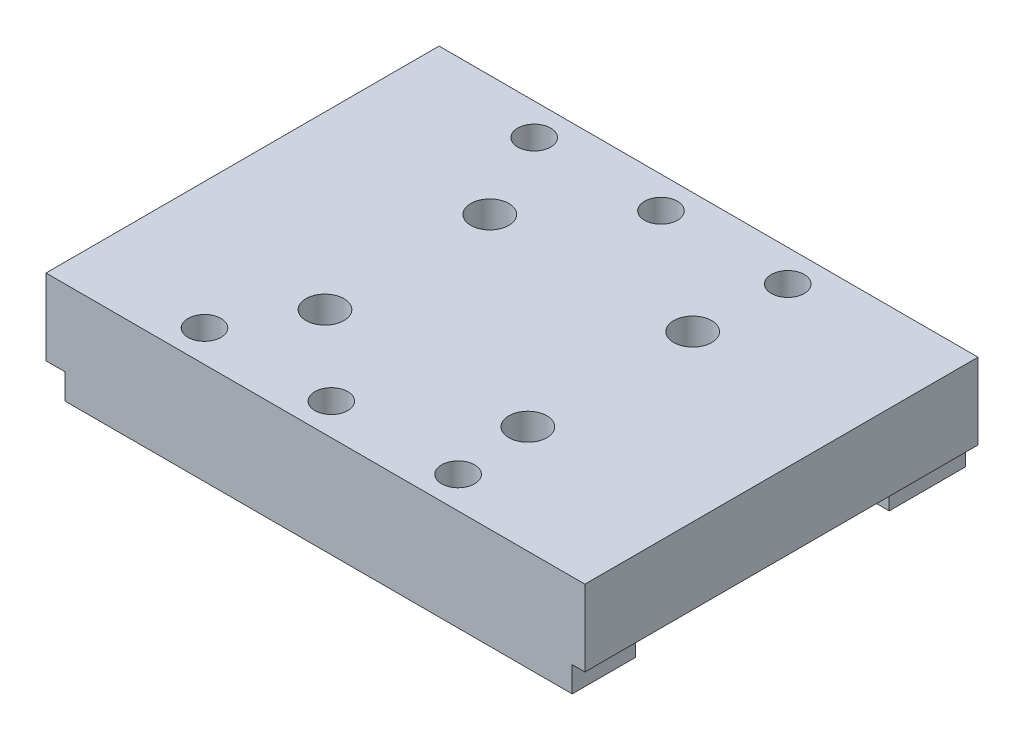
ISO-10303-21;
HEADER;
FILE_DESCRIPTION(('STEP AP214'),'2;1');
FILE_NAME('part.step','',(''),(''),'','','');
FILE_SCHEMA(('AUTOMOTIVE_DESIGN { 1 0 10303 214 1 1 1 1 }'));
ENDSEC;
DATA;
#1=APPLICATION_CONTEXT('core data for automotive mechanical design processes');
#2=APPLICATION_PROTOCOL_DEFINITION('international standard','automotive_design',2000,#1);
#3=PRODUCT_CONTEXT('',#1,'mechanical');
#4=PRODUCT('Part','Part','',(#3));
#5=PRODUCT_RELATED_PRODUCT_CATEGORY('part','',(#4));
#6=PRODUCT_DEFINITION_FORMATION('','',#4);
#7=PRODUCT_DEFINITION_CONTEXT('part definition',#1,'design');
#8=PRODUCT_DEFINITION('design','',#6,#7);
#9=PRODUCT_DEFINITION_SHAPE('','',#8);
#10=(LENGTH_UNIT() NAMED_UNIT(*) SI_UNIT(.MILLI.,.METRE.));
#11=(NAMED_UNIT(*) PLANE_ANGLE_UNIT() SI_UNIT($,.RADIAN.));
#12=(NAMED_UNIT(*) SI_UNIT($,.STERADIAN.) SOLID_ANGLE_UNIT());
#13=UNCERTAINTY_MEASURE_WITH_UNIT(LENGTH_MEASURE(1.E-05),#10,'distance_accuracy_value','');
#14=(GEOMETRIC_REPRESENTATION_CONTEXT(3) GLOBAL_UNCERTAINTY_ASSIGNED_CONTEXT((#13)) GLOBAL_UNIT_ASSIGNED_CONTEXT((#10,
#11,#12)) REPRESENTATION_CONTEXT('',''));
#15=CARTESIAN_POINT('',(0.,0.,0.));
#16=DIRECTION('',(0.,0.,1.));
#17=DIRECTION('',(1.,0.,0.));
#18=AXIS2_PLACEMENT_3D('',#15,#16,#17);
#19=CARTESIAN_POINT('',(40.,3.,0.));
#20=DIRECTION('',(-1.,0.,0.));
#21=DIRECTION('',(0.,0.,1.));
#22=AXIS2_PLACEMENT_3D('',#19,#20,#21);
#23=PLANE('',#22);
#24=DIRECTION('',(0.,0.,-1.));
#25=VECTOR('',#24,1.);
#26=CARTESIAN_POINT('',(40.,-3.,5.));
#27=LINE('',#26,#25);
#28=CARTESIAN_POINT('',(40.,-3.,5.));
#29=VERTEX_POINT('',#28);
#30=CARTESIAN_POINT('',(40.,-3.,0.));
#31=VERTEX_POINT('',#30);
#32=EDGE_CURVE('E43',#29,#31,#27,.T.);
#33=ORIENTED_EDGE('',*,*,#32,.F.);
#34=DIRECTION('',(0.,1.,0.));
#35=VECTOR('',#34,1.);
#36=CARTESIAN_POINT('',(40.,3.,5.));
#37=LINE('',#36,#35);
#38=CARTESIAN_POINT('',(40.,-5.,5.));
#39=VERTEX_POINT('',#38);
#40=EDGE_CURVE('E160',#39,#29,#37,.T.);
#41=ORIENTED_EDGE('',*,*,#40,.F.);
#42=DIRECTION('',(0.,0.,-1.));
#43=VECTOR('',#42,1.);
#44=CARTESIAN_POINT('',(40.,-5.,5.));
#45=LINE('',#44,#43);
#46=CARTESIAN_POINT('',(40.,-5.,0.));
#47=VERTEX_POINT('',#46);
#48=EDGE_CURVE('E255',#39,#47,#45,.T.);
#49=ORIENTED_EDGE('',*,*,#48,.T.);
#50=DIRECTION('',(0.,1.,0.));
#51=VECTOR('',#50,1.);
#52=CARTESIAN_POINT('',(40.,3.,0.));
#53=LINE('',#52,#51);
#54=EDGE_CURVE('E250',#47,#31,#53,.T.);
#55=ORIENTED_EDGE('',*,*,#54,.T.);
#56=EDGE_LOOP('',(#33,#41,#49,#55));
#57=FACE_BOUND('',#56,.T.);
#58=ADVANCED_FACE('F32',(#57),#23,.F.);
#59=CARTESIAN_POINT('',(40.,-3.,-20.));
#60=VERTEX_POINT('',#59);
#61=CARTESIAN_POINT('',(40.,-3.,-26.));
#62=VERTEX_POINT('',#61);
#63=EDGE_CURVE('E11',#60,#62,#27,.T.);
#64=ORIENTED_EDGE('',*,*,#63,.F.);
#65=DIRECTION('',(0.,-1.,0.));
#66=VECTOR('',#65,1.);
#67=CARTESIAN_POINT('',(40.,3.,-20.));
#68=LINE('',#67,#66);
#69=CARTESIAN_POINT('',(40.,-5.,-20.));
#70=VERTEX_POINT('',#69);
#71=EDGE_CURVE('E219',#60,#70,#68,.T.);
#72=ORIENTED_EDGE('',*,*,#71,.T.);
#73=DIRECTION('',(0.,0.,1.));
#74=VECTOR('',#73,1.);
#75=CARTESIAN_POINT('',(40.,-5.,-26.));
#76=LINE('',#75,#74);
#77=CARTESIAN_POINT('',(40.,-5.,-26.));
#78=VERTEX_POINT('',#77);
#79=EDGE_CURVE('E243',#78,#70,#76,.T.);
#80=ORIENTED_EDGE('',*,*,#79,.F.);
#81=DIRECTION('',(0.,-1.,0.));
#82=VECTOR('',#81,1.);
#83=CARTESIAN_POINT('',(40.,3.,-26.));
#84=LINE('',#83,#82);
#85=EDGE_CURVE('E222',#62,#78,#84,.T.);
#86=ORIENTED_EDGE('',*,*,#85,.F.);
#87=EDGE_LOOP('',(#64,#72,#80,#86));
#88=FACE_BOUND('',#87,.T.);
#89=ADVANCED_FACE('F322',(#88),#23,.F.);
#90=CARTESIAN_POINT('',(0.,3.,0.));
#91=DIRECTION('',(1.,0.,0.));
#92=DIRECTION('',(0.,0.,-1.));
#93=AXIS2_PLACEMENT_3D('',#90,#91,#92);
#94=PLANE('',#93);
#95=DIRECTION('',(0.,0.,1.));
#96=VECTOR('',#95,1.);
#97=CARTESIAN_POINT('',(0.,-3.,-26.));
#98=LINE('',#97,#96);
#99=CARTESIAN_POINT('',(0.,-3.,-26.));
#100=VERTEX_POINT('',#99);
#101=CARTESIAN_POINT('',(0.,-3.,-20.));
#102=VERTEX_POINT('',#101);
#103=EDGE_CURVE('E177',#100,#102,#98,.T.);
#104=ORIENTED_EDGE('',*,*,#103,.F.);
#105=DIRECTION('',(0.,1.,0.));
#106=VECTOR('',#105,1.);
#107=CARTESIAN_POINT('',(0.,3.,-26.));
#108=LINE('',#107,#106);
#109=CARTESIAN_POINT('',(0.,-5.,-26.));
#110=VERTEX_POINT('',#109);
#111=EDGE_CURVE('E227',#110,#100,#108,.T.);
#112=ORIENTED_EDGE('',*,*,#111,.F.);
#113=DIRECTION('',(0.,0.,1.));
#114=VECTOR('',#113,1.);
#115=CARTESIAN_POINT('',(0.,-5.,-26.));
#116=LINE('',#115,#114);
#117=CARTESIAN_POINT('',(0.,-5.,-20.));
#118=VERTEX_POINT('',#117);
#119=EDGE_CURVE('E232',#110,#118,#116,.T.);
#120=ORIENTED_EDGE('',*,*,#119,.T.);
#121=DIRECTION('',(0.,1.,0.));
#122=VECTOR('',#121,1.);
#123=CARTESIAN_POINT('',(0.,3.,-20.));
#124=LINE('',#123,#122);
#125=EDGE_CURVE('E225',#118,#102,#124,.T.);
#126=ORIENTED_EDGE('',*,*,#125,.T.);
#127=EDGE_LOOP('',(#104,#112,#120,#126));
#128=FACE_BOUND('',#127,.T.);
#129=ADVANCED_FACE('F34',(#128),#94,.F.);
#130=CARTESIAN_POINT('',(0.,-3.,0.));
#131=VERTEX_POINT('',#130);
#132=CARTESIAN_POINT('',(0.,-3.,5.));
#133=VERTEX_POINT('',#132);
#134=EDGE_CURVE('E41',#131,#133,#98,.T.);
#135=ORIENTED_EDGE('',*,*,#134,.F.);
#136=DIRECTION('',(0.,-1.,0.));
#137=VECTOR('',#136,1.);
#138=CARTESIAN_POINT('',(0.,3.,0.));
#139=LINE('',#138,#137);
#140=CARTESIAN_POINT('',(0.,-5.,0.));
#141=VERTEX_POINT('',#140);
#142=EDGE_CURVE('E246',#131,#141,#139,.T.);
#143=ORIENTED_EDGE('',*,*,#142,.T.);
#144=DIRECTION('',(0.,0.,-1.));
#145=VECTOR('',#144,1.);
#146=CARTESIAN_POINT('',(0.,-5.,5.));
#147=LINE('',#146,#145);
#148=CARTESIAN_POINT('',(0.,-5.,5.));
#149=VERTEX_POINT('',#148);
#150=EDGE_CURVE('E264',#149,#141,#147,.T.);
#151=ORIENTED_EDGE('',*,*,#150,.F.);
#152=DIRECTION('',(0.,-1.,0.));
#153=VECTOR('',#152,1.);
#154=CARTESIAN_POINT('',(0.,3.,5.));
#155=LINE('',#154,#153);
#156=EDGE_CURVE('E247',#133,#149,#155,.T.);
#157=ORIENTED_EDGE('',*,*,#156,.F.);
#158=EDGE_LOOP('',(#135,#143,#151,#157));
#159=FACE_BOUND('',#158,.T.);
#160=ADVANCED_FACE('F316',(#159),#94,.F.);
#161=CARTESIAN_POINT('',(0.,3.,0.));
#162=DIRECTION('',(0.,-1.,0.));
#163=DIRECTION('',(0.,0.,-1.));
#164=AXIS2_PLACEMENT_3D('',#161,#162,#163);
#165=PLANE('',#164);
#166=CARTESIAN_POINT('',(18.5,3.,-23.5));
#167=DIRECTION('',(0.,1.,0.));
#168=DIRECTION('',(0.,0.,1.));
#169=AXIS2_PLACEMENT_3D('',#166,#167,#168);
#170=CIRCLE('',#169,1.3);
#171=CARTESIAN_POINT('',(18.5,3.,-22.2));
#172=VERTEX_POINT('',#171);
#173=EDGE_CURVE('E196',#172,#172,#170,.T.);
#174=ORIENTED_EDGE('',*,*,#173,.F.);
#175=EDGE_LOOP('',(#174));
#176=FACE_BOUND('',#175,.T.);
#177=CARTESIAN_POINT('',(28.5,3.,-23.5));
#178=DIRECTION('',(0.,1.,0.));
#179=DIRECTION('',(0.,0.,1.));
#180=AXIS2_PLACEMENT_3D('',#177,#178,#179);
#181=CIRCLE('',#180,1.29999999999999);
#182=CARTESIAN_POINT('',(28.5,3.,-22.2));
#183=VERTEX_POINT('',#182);
#184=EDGE_CURVE('E202',#183,#183,#181,.T.);
#185=ORIENTED_EDGE('',*,*,#184,.F.);
#186=EDGE_LOOP('',(#185));
#187=FACE_BOUND('',#186,.T.);
#188=CARTESIAN_POINT('',(8.5,3.,2.5));
#189=DIRECTION('',(0.,1.,0.));
#190=DIRECTION('',(0.,0.,1.));
#191=AXIS2_PLACEMENT_3D('',#188,#189,#190);
#192=CIRCLE('',#191,1.3);
#193=CARTESIAN_POINT('',(8.5,3.,3.8));
#194=VERTEX_POINT('',#193);
#195=EDGE_CURVE('E208',#194,#194,#192,.T.);
#196=ORIENTED_EDGE('',*,*,#195,.F.);
#197=EDGE_LOOP('',(#196));
#198=FACE_BOUND('',#197,.T.);
#199=CARTESIAN_POINT('',(18.5,3.,2.5));
#200=DIRECTION('',(0.,1.,0.));
#201=DIRECTION('',(0.,0.,1.));
#202=AXIS2_PLACEMENT_3D('',#199,#200,#201);
#203=CIRCLE('',#202,1.3);
#204=CARTESIAN_POINT('',(18.5,3.,3.8));
#205=VERTEX_POINT('',#204);
#206=EDGE_CURVE('E189',#205,#205,#203,.T.);
#207=ORIENTED_EDGE('',*,*,#206,.F.);
#208=EDGE_LOOP('',(#207));
#209=FACE_BOUND('',#208,.T.);
#210=CARTESIAN_POINT('',(28.5,3.,2.5));
#211=DIRECTION('',(0.,1.,0.));
#212=DIRECTION('',(0.,0.,1.));
#213=AXIS2_PLACEMENT_3D('',#210,#211,#212);
#214=CIRCLE('',#213,1.29999999999999);
#215=CARTESIAN_POINT('',(28.5,3.,3.8));
#216=VERTEX_POINT('',#215);
#217=EDGE_CURVE('E180',#216,#216,#214,.T.);
#218=ORIENTED_EDGE('',*,*,#217,.F.);
#219=EDGE_LOOP('',(#218));
#220=FACE_BOUND('',#219,.T.);
#221=CARTESIAN_POINT('',(8.5,3.,-23.5));
#222=DIRECTION('',(0.,1.,0.));
#223=DIRECTION('',(0.,0.,1.));
#224=AXIS2_PLACEMENT_3D('',#221,#222,#223);
#225=CIRCLE('',#224,1.3);
#226=CARTESIAN_POINT('',(8.5,3.,-22.2));
#227=VERTEX_POINT('',#226);
#228=EDGE_CURVE('E195',#227,#227,#225,.T.);
#229=ORIENTED_EDGE('',*,*,#228,.F.);
#230=EDGE_LOOP('',(#229));
#231=FACE_BOUND('',#230,.T.);
#232=CARTESIAN_POINT('',(28.,3.,-3.5));
#233=DIRECTION('',(0.,1.,0.));
#234=DIRECTION('',(0.,0.,1.));
#235=AXIS2_PLACEMENT_3D('',#232,#233,#234);
#236=CIRCLE('',#235,1.5);
#237=CARTESIAN_POINT('',(28.,3.,-2.));
#238=VERTEX_POINT('',#237);
#239=EDGE_CURVE('E267',#238,#238,#236,.T.);
#240=ORIENTED_EDGE('',*,*,#239,.F.);
#241=EDGE_LOOP('',(#240));
#242=FACE_BOUND('',#241,.T.);
#243=CARTESIAN_POINT('',(12.,3.,-3.5));
#244=DIRECTION('',(0.,1.,0.));
#245=DIRECTION('',(0.,0.,1.));
#246=AXIS2_PLACEMENT_3D('',#243,#244,#245);
#247=CIRCLE('',#246,1.5);
#248=CARTESIAN_POINT('',(12.,3.,-2.));
#249=VERTEX_POINT('',#248);
#250=EDGE_CURVE('E278',#249,#249,#247,.T.);
#251=ORIENTED_EDGE('',*,*,#250,.F.);
#252=EDGE_LOOP('',(#251));
#253=FACE_BOUND('',#252,.T.);
#254=CARTESIAN_POINT('',(12.,3.,-16.5));
#255=DIRECTION('',(0.,1.,0.));
#256=DIRECTION('',(0.,0.,1.));
#257=AXIS2_PLACEMENT_3D('',#254,#255,#256);
#258=CIRCLE('',#257,1.5);
#259=CARTESIAN_POINT('',(12.,3.,-15.));
#260=VERTEX_POINT('',#259);
#261=EDGE_CURVE('E272',#260,#260,#258,.T.);
#262=ORIENTED_EDGE('',*,*,#261,.F.);
#263=EDGE_LOOP('',(#262));
#264=FACE_BOUND('',#263,.T.);
#265=CARTESIAN_POINT('',(28.,3.,-16.5));
#266=DIRECTION('',(0.,1.,0.));
#267=DIRECTION('',(0.,0.,1.));
#268=AXIS2_PLACEMENT_3D('',#265,#266,#267);
#269=CIRCLE('',#268,1.5);
#270=CARTESIAN_POINT('',(28.,3.,-15.));
#271=VERTEX_POINT('',#270);
#272=EDGE_CURVE('E271',#271,#271,#269,.T.);
#273=ORIENTED_EDGE('',*,*,#272,.F.);
#274=EDGE_LOOP('',(#273));
#275=FACE_BOUND('',#274,.T.);
#276=DIRECTION('',(1.,0.,0.));
#277=VECTOR('',#276,1.);
#278=CARTESIAN_POINT('',(40.,3.,-26.));
#279=LINE('',#278,#277);
#280=CARTESIAN_POINT('',(-1.5,3.,-26.));
#281=VERTEX_POINT('',#280);
#282=CARTESIAN_POINT('',(41.,3.,-26.));
#283=VERTEX_POINT('',#282);
#284=EDGE_CURVE('E230',#281,#283,#279,.T.);
#285=ORIENTED_EDGE('',*,*,#284,.F.);
#286=DIRECTION('',(0.,0.,1.));
#287=VECTOR('',#286,1.);
#288=CARTESIAN_POINT('',(-1.5,3.,-26.));
#289=LINE('',#288,#287);
#290=CARTESIAN_POINT('',(-1.5,3.,5.));
#291=VERTEX_POINT('',#290);
#292=EDGE_CURVE('E173',#281,#291,#289,.T.);
#293=ORIENTED_EDGE('',*,*,#292,.T.);
#294=DIRECTION('',(-1.,0.,0.));
#295=VECTOR('',#294,1.);
#296=CARTESIAN_POINT('',(0.,3.,5.));
#297=LINE('',#296,#295);
#298=CARTESIAN_POINT('',(41.,3.,5.));
#299=VERTEX_POINT('',#298);
#300=EDGE_CURVE('E253',#299,#291,#297,.T.);
#301=ORIENTED_EDGE('',*,*,#300,.F.);
#302=DIRECTION('',(0.,0.,1.));
#303=VECTOR('',#302,1.);
#304=CARTESIAN_POINT('',(41.,3.,5.));
#305=LINE('',#304,#303);
#306=EDGE_CURVE('E156',#283,#299,#305,.T.);
#307=ORIENTED_EDGE('',*,*,#306,.F.);
#308=EDGE_LOOP('',(#285,#293,#301,#307));
#309=FACE_BOUND('',#308,.T.);
#310=ADVANCED_FACE('F332',(#176,#187,#198,#209,#220,#231,#242,#253,#264,#275,#309),#165,.F.);
#311=CARTESIAN_POINT('',(0.,0.,0.));
#312=DIRECTION('',(0.,-1.,0.));
#313=DIRECTION('',(0.,0.,-1.));
#314=AXIS2_PLACEMENT_3D('',#311,#312,#313);
#315=PLANE('',#314);
#316=CARTESIAN_POINT('',(28.,0.,-3.5));
#317=DIRECTION('',(0.,1.,0.));
#318=DIRECTION('',(0.,0.,1.));
#319=AXIS2_PLACEMENT_3D('',#316,#317,#318);
#320=CIRCLE('',#319,1.5);
#321=CARTESIAN_POINT('',(28.,0.,-2.));
#322=VERTEX_POINT('',#321);
#323=EDGE_CURVE('E281',#322,#322,#320,.T.);
#324=ORIENTED_EDGE('',*,*,#323,.T.);
#325=EDGE_LOOP('',(#324));
#326=FACE_BOUND('',#325,.T.);
#327=CARTESIAN_POINT('',(12.,0.,-3.5));
#328=DIRECTION('',(0.,1.,0.));
#329=DIRECTION('',(0.,0.,1.));
#330=AXIS2_PLACEMENT_3D('',#327,#328,#329);
#331=CIRCLE('',#330,1.5);
#332=CARTESIAN_POINT('',(12.,0.,-2.));
#333=VERTEX_POINT('',#332);
#334=EDGE_CURVE('E275',#333,#333,#331,.T.);
#335=ORIENTED_EDGE('',*,*,#334,.T.);
#336=EDGE_LOOP('',(#335));
#337=FACE_BOUND('',#336,.T.);
#338=CARTESIAN_POINT('',(12.,0.,-16.5));
#339=DIRECTION('',(0.,1.,0.));
#340=DIRECTION('',(0.,0.,1.));
#341=AXIS2_PLACEMENT_3D('',#338,#339,#340);
#342=CIRCLE('',#341,1.5);
#343=CARTESIAN_POINT('',(12.,0.,-15.));
#344=VERTEX_POINT('',#343);
#345=EDGE_CURVE('E268',#344,#344,#342,.T.);
#346=ORIENTED_EDGE('',*,*,#345,.T.);
#347=EDGE_LOOP('',(#346));
#348=FACE_BOUND('',#347,.T.);
#349=CARTESIAN_POINT('',(28.,0.,-16.5));
#350=DIRECTION('',(0.,1.,0.));
#351=DIRECTION('',(0.,0.,1.));
#352=AXIS2_PLACEMENT_3D('',#349,#350,#351);
#353=CIRCLE('',#352,1.5);
#354=CARTESIAN_POINT('',(28.,0.,-15.));
#355=VERTEX_POINT('',#354);
#356=EDGE_CURVE('E286',#355,#355,#353,.T.);
#357=ORIENTED_EDGE('',*,*,#356,.T.);
#358=EDGE_LOOP('',(#357));
#359=FACE_BOUND('',#358,.T.);
#360=DIRECTION('',(0.,0.,1.));
#361=VECTOR('',#360,1.);
#362=CARTESIAN_POINT('',(0.,0.,0.));
#363=LINE('',#362,#361);
#364=CARTESIAN_POINT('',(0.,0.,-20.));
#365=VERTEX_POINT('',#364);
#366=CARTESIAN_POINT('',(0.,0.,0.));
#367=VERTEX_POINT('',#366);
#368=EDGE_CURVE('E289',#365,#367,#363,.T.);
#369=ORIENTED_EDGE('',*,*,#368,.F.);
#370=DIRECTION('',(-1.,0.,0.));
#371=VECTOR('',#370,1.);
#372=CARTESIAN_POINT('',(0.,0.,-20.));
#373=LINE('',#372,#371);
#374=CARTESIAN_POINT('',(40.,0.,-20.));
#375=VERTEX_POINT('',#374);
#376=EDGE_CURVE('E36',#375,#365,#373,.T.);
#377=ORIENTED_EDGE('',*,*,#376,.F.);
#378=DIRECTION('',(0.,0.,-1.));
#379=VECTOR('',#378,1.);
#380=CARTESIAN_POINT('',(40.,0.,0.));
#381=LINE('',#380,#379);
#382=CARTESIAN_POINT('',(40.,0.,0.));
#383=VERTEX_POINT('',#382);
#384=EDGE_CURVE('E295',#383,#375,#381,.T.);
#385=ORIENTED_EDGE('',*,*,#384,.F.);
#386=DIRECTION('',(1.,0.,0.));
#387=VECTOR('',#386,1.);
#388=CARTESIAN_POINT('',(0.,0.,0.));
#389=LINE('',#388,#387);
#390=EDGE_CURVE('E294',#367,#383,#389,.T.);
#391=ORIENTED_EDGE('',*,*,#390,.F.);
#392=EDGE_LOOP('',(#369,#377,#385,#391));
#393=FACE_BOUND('',#392,.T.);
#394=ADVANCED_FACE('F328',(#326,#337,#348,#359,#393),#315,.T.);
#395=CARTESIAN_POINT('',(28.,0.,-16.5));
#396=DIRECTION('',(0.,1.,0.));
#397=DIRECTION('',(0.,0.,1.));
#398=AXIS2_PLACEMENT_3D('',#395,#396,#397);
#399=CYLINDRICAL_SURFACE('',#398,1.5);
#400=ORIENTED_EDGE('',*,*,#356,.F.);
#401=EDGE_LOOP('',(#400));
#402=FACE_BOUND('',#401,.T.);
#403=ORIENTED_EDGE('',*,*,#272,.T.);
#404=EDGE_LOOP('',(#403));
#405=FACE_BOUND('',#404,.T.);
#406=ADVANCED_FACE('F331',(#402,#405),#399,.F.);
#407=CARTESIAN_POINT('',(12.,0.,-16.5));
#408=DIRECTION('',(0.,1.,0.));
#409=DIRECTION('',(0.,0.,1.));
#410=AXIS2_PLACEMENT_3D('',#407,#408,#409);
#411=CYLINDRICAL_SURFACE('',#410,1.5);
#412=ORIENTED_EDGE('',*,*,#345,.F.);
#413=EDGE_LOOP('',(#412));
#414=FACE_BOUND('',#413,.T.);
#415=ORIENTED_EDGE('',*,*,#261,.T.);
#416=EDGE_LOOP('',(#415));
#417=FACE_BOUND('',#416,.T.);
#418=ADVANCED_FACE('F339',(#414,#417),#411,.F.);
#419=CARTESIAN_POINT('',(12.,0.,-3.5));
#420=DIRECTION('',(0.,1.,0.));
#421=DIRECTION('',(0.,0.,1.));
#422=AXIS2_PLACEMENT_3D('',#419,#420,#421);
#423=CYLINDRICAL_SURFACE('',#422,1.5);
#424=ORIENTED_EDGE('',*,*,#334,.F.);
#425=EDGE_LOOP('',(#424));
#426=FACE_BOUND('',#425,.T.);
#427=ORIENTED_EDGE('',*,*,#250,.T.);
#428=EDGE_LOOP('',(#427));
#429=FACE_BOUND('',#428,.T.);
#430=ADVANCED_FACE('F344',(#426,#429),#423,.F.);
#431=CARTESIAN_POINT('',(28.,0.,-3.5));
#432=DIRECTION('',(0.,1.,0.));
#433=DIRECTION('',(0.,0.,1.));
#434=AXIS2_PLACEMENT_3D('',#431,#432,#433);
#435=CYLINDRICAL_SURFACE('',#434,1.5);
#436=ORIENTED_EDGE('',*,*,#323,.F.);
#437=EDGE_LOOP('',(#436));
#438=FACE_BOUND('',#437,.T.);
#439=ORIENTED_EDGE('',*,*,#239,.T.);
#440=EDGE_LOOP('',(#439));
#441=FACE_BOUND('',#440,.T.);
#442=ADVANCED_FACE('F341',(#438,#441),#435,.F.);
#443=CARTESIAN_POINT('',(0.,0.,0.));
#444=DIRECTION('',(0.,0.,1.));
#445=DIRECTION('',(1.,0.,0.));
#446=AXIS2_PLACEMENT_3D('',#443,#444,#445);
#447=PLANE('',#446);
#448=EDGE_CURVE('E256',#367,#131,#139,.T.);
#449=ORIENTED_EDGE('',*,*,#448,.F.);
#450=ORIENTED_EDGE('',*,*,#390,.T.);
#451=EDGE_CURVE('E51',#31,#383,#53,.T.);
#452=ORIENTED_EDGE('',*,*,#451,.F.);
#453=ORIENTED_EDGE('',*,*,#54,.F.);
#454=DIRECTION('',(1.,0.,0.));
#455=VECTOR('',#454,1.);
#456=CARTESIAN_POINT('',(0.,-5.,0.));
#457=LINE('',#456,#455);
#458=EDGE_CURVE('E259',#141,#47,#457,.T.);
#459=ORIENTED_EDGE('',*,*,#458,.F.);
#460=ORIENTED_EDGE('',*,*,#142,.F.);
#461=EDGE_LOOP('',(#449,#450,#452,#453,#459,#460));
#462=FACE_BOUND('',#461,.T.);
#463=ADVANCED_FACE('F312',(#462),#447,.F.);
#464=CARTESIAN_POINT('',(0.,-5.,5.));
#465=DIRECTION('',(0.,1.,0.));
#466=DIRECTION('',(0.,0.,1.));
#467=AXIS2_PLACEMENT_3D('',#464,#465,#466);
#468=PLANE('',#467);
#469=CARTESIAN_POINT('',(8.5,-5.,2.5));
#470=DIRECTION('',(0.,1.,0.));
#471=DIRECTION('',(0.,0.,1.));
#472=AXIS2_PLACEMENT_3D('',#469,#470,#471);
#473=CIRCLE('',#472,1.3);
#474=CARTESIAN_POINT('',(8.5,-5.,3.8));
#475=VERTEX_POINT('',#474);
#476=EDGE_CURVE('E205',#475,#475,#473,.T.);
#477=ORIENTED_EDGE('',*,*,#476,.T.);
#478=EDGE_LOOP('',(#477));
#479=FACE_BOUND('',#478,.T.);
#480=CARTESIAN_POINT('',(18.5,-5.,2.5));
#481=DIRECTION('',(0.,1.,0.));
#482=DIRECTION('',(0.,0.,1.));
#483=AXIS2_PLACEMENT_3D('',#480,#481,#482);
#484=CIRCLE('',#483,1.3);
#485=CARTESIAN_POINT('',(18.5,-5.,3.8));
#486=VERTEX_POINT('',#485);
#487=EDGE_CURVE('E211',#486,#486,#484,.T.);
#488=ORIENTED_EDGE('',*,*,#487,.T.);
#489=EDGE_LOOP('',(#488));
#490=FACE_BOUND('',#489,.T.);
#491=CARTESIAN_POINT('',(28.5,-5.,2.5));
#492=DIRECTION('',(0.,1.,0.));
#493=DIRECTION('',(0.,0.,1.));
#494=AXIS2_PLACEMENT_3D('',#491,#492,#493);
#495=CIRCLE('',#494,1.29999999999999);
#496=CARTESIAN_POINT('',(28.5,-5.,3.8));
#497=VERTEX_POINT('',#496);
#498=EDGE_CURVE('E186',#497,#497,#495,.T.);
#499=ORIENTED_EDGE('',*,*,#498,.T.);
#500=EDGE_LOOP('',(#499));
#501=FACE_BOUND('',#500,.T.);
#502=ORIENTED_EDGE('',*,*,#458,.T.);
#503=ORIENTED_EDGE('',*,*,#48,.F.);
#504=DIRECTION('',(1.,0.,0.));
#505=VECTOR('',#504,1.);
#506=CARTESIAN_POINT('',(0.,-5.,5.));
#507=LINE('',#506,#505);
#508=EDGE_CURVE('E249',#149,#39,#507,.T.);
#509=ORIENTED_EDGE('',*,*,#508,.F.);
#510=ORIENTED_EDGE('',*,*,#150,.T.);
#511=EDGE_LOOP('',(#502,#503,#509,#510));
#512=FACE_BOUND('',#511,.T.);
#513=ADVANCED_FACE('F320',(#479,#490,#501,#512),#468,.F.);
#514=CARTESIAN_POINT('',(0.,0.,5.));
#515=DIRECTION('',(0.,0.,1.));
#516=DIRECTION('',(1.,0.,0.));
#517=AXIS2_PLACEMENT_3D('',#514,#515,#516);
#518=PLANE('',#517);
#519=ORIENTED_EDGE('',*,*,#300,.T.);
#520=DIRECTION('',(0.,-1.,0.));
#521=VECTOR('',#520,1.);
#522=CARTESIAN_POINT('',(-1.5,3.,5.));
#523=LINE('',#522,#521);
#524=CARTESIAN_POINT('',(-1.5,-3.,5.));
#525=VERTEX_POINT('',#524);
#526=EDGE_CURVE('E161',#291,#525,#523,.T.);
#527=ORIENTED_EDGE('',*,*,#526,.T.);
#528=DIRECTION('',(1.,0.,0.));
#529=VECTOR('',#528,1.);
#530=CARTESIAN_POINT('',(-1.5,-3.,5.));
#531=LINE('',#530,#529);
#532=EDGE_CURVE('E164',#525,#133,#531,.T.);
#533=ORIENTED_EDGE('',*,*,#532,.T.);
#534=ORIENTED_EDGE('',*,*,#156,.T.);
#535=ORIENTED_EDGE('',*,*,#508,.T.);
#536=ORIENTED_EDGE('',*,*,#40,.T.);
#537=DIRECTION('',(-1.,0.,0.));
#538=VECTOR('',#537,1.);
#539=CARTESIAN_POINT('',(41.,-3.,5.));
#540=LINE('',#539,#538);
#541=CARTESIAN_POINT('',(41.,-3.,5.));
#542=VERTEX_POINT('',#541);
#543=EDGE_CURVE('E143',#542,#29,#540,.T.);
#544=ORIENTED_EDGE('',*,*,#543,.F.);
#545=DIRECTION('',(0.,-1.,0.));
#546=VECTOR('',#545,1.);
#547=CARTESIAN_POINT('',(41.,3.,5.));
#548=LINE('',#547,#546);
#549=EDGE_CURVE('E150',#299,#542,#548,.T.);
#550=ORIENTED_EDGE('',*,*,#549,.F.);
#551=EDGE_LOOP('',(#519,#527,#533,#534,#535,#536,#544,#550));
#552=FACE_BOUND('',#551,.T.);
#553=ADVANCED_FACE('F159',(#552),#518,.T.);
#554=CARTESIAN_POINT('',(0.,0.,-20.));
#555=DIRECTION('',(0.,0.,-1.));
#556=DIRECTION('',(-1.,0.,0.));
#557=AXIS2_PLACEMENT_3D('',#554,#555,#556);
#558=PLANE('',#557);
#559=EDGE_CURVE('E233',#375,#60,#68,.T.);
#560=ORIENTED_EDGE('',*,*,#559,.F.);
#561=ORIENTED_EDGE('',*,*,#376,.T.);
#562=EDGE_CURVE('E238',#102,#365,#124,.T.);
#563=ORIENTED_EDGE('',*,*,#562,.F.);
#564=ORIENTED_EDGE('',*,*,#125,.F.);
#565=DIRECTION('',(-1.,0.,0.));
#566=VECTOR('',#565,1.);
#567=CARTESIAN_POINT('',(40.,-5.,-20.));
#568=LINE('',#567,#566);
#569=EDGE_CURVE('E236',#70,#118,#568,.T.);
#570=ORIENTED_EDGE('',*,*,#569,.F.);
#571=ORIENTED_EDGE('',*,*,#71,.F.);
#572=EDGE_LOOP('',(#560,#561,#563,#564,#570,#571));
#573=FACE_BOUND('',#572,.T.);
#574=ADVANCED_FACE('F359',(#573),#558,.F.);
#575=CARTESIAN_POINT('',(40.,-5.,-26.));
#576=DIRECTION('',(0.,1.,0.));
#577=DIRECTION('',(0.,0.,1.));
#578=AXIS2_PLACEMENT_3D('',#575,#576,#577);
#579=PLANE('',#578);
#580=CARTESIAN_POINT('',(18.5,-5.,-23.5));
#581=DIRECTION('',(0.,1.,0.));
#582=DIRECTION('',(0.,0.,1.));
#583=AXIS2_PLACEMENT_3D('',#580,#581,#582);
#584=CIRCLE('',#583,1.3);
#585=CARTESIAN_POINT('',(18.5,-5.,-22.2));
#586=VERTEX_POINT('',#585);
#587=EDGE_CURVE('E192',#586,#586,#584,.T.);
#588=ORIENTED_EDGE('',*,*,#587,.T.);
#589=EDGE_LOOP('',(#588));
#590=FACE_BOUND('',#589,.T.);
#591=CARTESIAN_POINT('',(28.5,-5.,-23.5));
#592=DIRECTION('',(0.,1.,0.));
#593=DIRECTION('',(0.,0.,1.));
#594=AXIS2_PLACEMENT_3D('',#591,#592,#593);
#595=CIRCLE('',#594,1.29999999999999);
#596=CARTESIAN_POINT('',(28.5,-5.,-22.2));
#597=VERTEX_POINT('',#596);
#598=EDGE_CURVE('E199',#597,#597,#595,.T.);
#599=ORIENTED_EDGE('',*,*,#598,.T.);
#600=EDGE_LOOP('',(#599));
#601=FACE_BOUND('',#600,.T.);
#602=CARTESIAN_POINT('',(8.5,-5.,-23.5));
#603=DIRECTION('',(0.,1.,0.));
#604=DIRECTION('',(0.,0.,1.));
#605=AXIS2_PLACEMENT_3D('',#602,#603,#604);
#606=CIRCLE('',#605,1.3);
#607=CARTESIAN_POINT('',(8.5,-5.,-22.2));
#608=VERTEX_POINT('',#607);
#609=EDGE_CURVE('E216',#608,#608,#606,.T.);
#610=ORIENTED_EDGE('',*,*,#609,.T.);
#611=EDGE_LOOP('',(#610));
#612=FACE_BOUND('',#611,.T.);
#613=ORIENTED_EDGE('',*,*,#569,.T.);
#614=ORIENTED_EDGE('',*,*,#119,.F.);
#615=DIRECTION('',(-1.,0.,0.));
#616=VECTOR('',#615,1.);
#617=CARTESIAN_POINT('',(40.,-5.,-26.));
#618=LINE('',#617,#616);
#619=EDGE_CURVE('E224',#78,#110,#618,.T.);
#620=ORIENTED_EDGE('',*,*,#619,.F.);
#621=ORIENTED_EDGE('',*,*,#79,.T.);
#622=EDGE_LOOP('',(#613,#614,#620,#621));
#623=FACE_BOUND('',#622,.T.);
#624=ADVANCED_FACE('F360',(#590,#601,#612,#623),#579,.F.);
#625=CARTESIAN_POINT('',(0.,0.,-26.));
#626=DIRECTION('',(0.,0.,-1.));
#627=DIRECTION('',(-1.,0.,0.));
#628=AXIS2_PLACEMENT_3D('',#625,#626,#627);
#629=PLANE('',#628);
#630=ORIENTED_EDGE('',*,*,#284,.T.);
#631=DIRECTION('',(0.,1.,0.));
#632=VECTOR('',#631,1.);
#633=CARTESIAN_POINT('',(41.,3.,-26.));
#634=LINE('',#633,#632);
#635=CARTESIAN_POINT('',(41.,-3.,-26.));
#636=VERTEX_POINT('',#635);
#637=EDGE_CURVE('E149',#636,#283,#634,.T.);
#638=ORIENTED_EDGE('',*,*,#637,.F.);
#639=DIRECTION('',(-1.,0.,0.));
#640=VECTOR('',#639,1.);
#641=CARTESIAN_POINT('',(41.,-3.,-26.));
#642=LINE('',#641,#640);
#643=EDGE_CURVE('E145',#636,#62,#642,.T.);
#644=ORIENTED_EDGE('',*,*,#643,.T.);
#645=ORIENTED_EDGE('',*,*,#85,.T.);
#646=ORIENTED_EDGE('',*,*,#619,.T.);
#647=ORIENTED_EDGE('',*,*,#111,.T.);
#648=DIRECTION('',(1.,0.,0.));
#649=VECTOR('',#648,1.);
#650=CARTESIAN_POINT('',(-1.5,-3.,-26.));
#651=LINE('',#650,#649);
#652=CARTESIAN_POINT('',(-1.5,-3.,-26.));
#653=VERTEX_POINT('',#652);
#654=EDGE_CURVE('E171',#653,#100,#651,.T.);
#655=ORIENTED_EDGE('',*,*,#654,.F.);
#656=DIRECTION('',(0.,-1.,0.));
#657=VECTOR('',#656,1.);
#658=CARTESIAN_POINT('',(-1.5,3.,-26.));
#659=LINE('',#658,#657);
#660=EDGE_CURVE('E168',#281,#653,#659,.T.);
#661=ORIENTED_EDGE('',*,*,#660,.F.);
#662=EDGE_LOOP('',(#630,#638,#644,#645,#646,#647,#655,#661));
#663=FACE_BOUND('',#662,.T.);
#664=ADVANCED_FACE('F363',(#663),#629,.T.);
#665=CARTESIAN_POINT('',(8.5,-5.,-23.5));
#666=DIRECTION('',(0.,1.,0.));
#667=DIRECTION('',(0.,0.,1.));
#668=AXIS2_PLACEMENT_3D('',#665,#666,#667);
#669=CYLINDRICAL_SURFACE('',#668,1.3);
#670=ORIENTED_EDGE('',*,*,#609,.F.);
#671=EDGE_LOOP('',(#670));
#672=FACE_BOUND('',#671,.T.);
#673=ORIENTED_EDGE('',*,*,#228,.T.);
#674=EDGE_LOOP('',(#673));
#675=FACE_BOUND('',#674,.T.);
#676=ADVANCED_FACE('F369',(#672,#675),#669,.F.);
#677=CARTESIAN_POINT('',(28.5,-5.,-23.5));
#678=DIRECTION('',(0.,1.,0.));
#679=DIRECTION('',(0.,0.,1.));
#680=AXIS2_PLACEMENT_3D('',#677,#678,#679);
#681=CYLINDRICAL_SURFACE('',#680,1.29999999999999);
#682=ORIENTED_EDGE('',*,*,#598,.F.);
#683=EDGE_LOOP('',(#682));
#684=FACE_BOUND('',#683,.T.);
#685=ORIENTED_EDGE('',*,*,#184,.T.);
#686=EDGE_LOOP('',(#685));
#687=FACE_BOUND('',#686,.T.);
#688=ADVANCED_FACE('F373',(#684,#687),#681,.F.);
#689=CARTESIAN_POINT('',(18.5,-5.,-23.5));
#690=DIRECTION('',(0.,1.,0.));
#691=DIRECTION('',(0.,0.,1.));
#692=AXIS2_PLACEMENT_3D('',#689,#690,#691);
#693=CYLINDRICAL_SURFACE('',#692,1.3);
#694=ORIENTED_EDGE('',*,*,#587,.F.);
#695=EDGE_LOOP('',(#694));
#696=FACE_BOUND('',#695,.T.);
#697=ORIENTED_EDGE('',*,*,#173,.T.);
#698=EDGE_LOOP('',(#697));
#699=FACE_BOUND('',#698,.T.);
#700=ADVANCED_FACE('F386',(#696,#699),#693,.F.);
#701=CARTESIAN_POINT('',(28.5,-5.,2.5));
#702=DIRECTION('',(0.,1.,0.));
#703=DIRECTION('',(0.,0.,1.));
#704=AXIS2_PLACEMENT_3D('',#701,#702,#703);
#705=CYLINDRICAL_SURFACE('',#704,1.29999999999999);
#706=ORIENTED_EDGE('',*,*,#498,.F.);
#707=EDGE_LOOP('',(#706));
#708=FACE_BOUND('',#707,.T.);
#709=ORIENTED_EDGE('',*,*,#217,.T.);
#710=EDGE_LOOP('',(#709));
#711=FACE_BOUND('',#710,.T.);
#712=ADVANCED_FACE('F379',(#708,#711),#705,.F.);
#713=CARTESIAN_POINT('',(18.5,-5.,2.5));
#714=DIRECTION('',(0.,1.,0.));
#715=DIRECTION('',(0.,0.,1.));
#716=AXIS2_PLACEMENT_3D('',#713,#714,#715);
#717=CYLINDRICAL_SURFACE('',#716,1.3);
#718=ORIENTED_EDGE('',*,*,#487,.F.);
#719=EDGE_LOOP('',(#718));
#720=FACE_BOUND('',#719,.T.);
#721=ORIENTED_EDGE('',*,*,#206,.T.);
#722=EDGE_LOOP('',(#721));
#723=FACE_BOUND('',#722,.T.);
#724=ADVANCED_FACE('F375',(#720,#723),#717,.F.);
#725=CARTESIAN_POINT('',(8.5,-5.,2.5));
#726=DIRECTION('',(0.,1.,0.));
#727=DIRECTION('',(0.,0.,1.));
#728=AXIS2_PLACEMENT_3D('',#725,#726,#727);
#729=CYLINDRICAL_SURFACE('',#728,1.3);
#730=ORIENTED_EDGE('',*,*,#476,.F.);
#731=EDGE_LOOP('',(#730));
#732=FACE_BOUND('',#731,.T.);
#733=ORIENTED_EDGE('',*,*,#195,.T.);
#734=EDGE_LOOP('',(#733));
#735=FACE_BOUND('',#734,.T.);
#736=ADVANCED_FACE('F378',(#732,#735),#729,.F.);
#737=CARTESIAN_POINT('',(0.,-3.,-26.));
#738=DIRECTION('',(1.,0.,0.));
#739=DIRECTION('',(0.,0.,-1.));
#740=AXIS2_PLACEMENT_3D('',#737,#738,#739);
#741=PLANE('',#740);
#742=ORIENTED_EDGE('',*,*,#368,.T.);
#743=ORIENTED_EDGE('',*,*,#448,.T.);
#744=EDGE_CURVE('E181',#102,#131,#98,.T.);
#745=ORIENTED_EDGE('',*,*,#744,.F.);
#746=ORIENTED_EDGE('',*,*,#562,.T.);
#747=EDGE_LOOP('',(#742,#743,#745,#746));
#748=FACE_BOUND('',#747,.T.);
#749=ADVANCED_FACE('F309',(#748),#741,.T.);
#750=CARTESIAN_POINT('',(-1.5,-3.,-26.));
#751=DIRECTION('',(0.,-1.,0.));
#752=DIRECTION('',(1.,0.,0.));
#753=AXIS2_PLACEMENT_3D('',#750,#751,#752);
#754=PLANE('',#753);
#755=ORIENTED_EDGE('',*,*,#532,.F.);
#756=DIRECTION('',(0.,0.,1.));
#757=VECTOR('',#756,1.);
#758=CARTESIAN_POINT('',(-1.5,-3.,-26.));
#759=LINE('',#758,#757);
#760=EDGE_CURVE('E182',#653,#525,#759,.T.);
#761=ORIENTED_EDGE('',*,*,#760,.F.);
#762=ORIENTED_EDGE('',*,*,#654,.T.);
#763=ORIENTED_EDGE('',*,*,#103,.T.);
#764=ORIENTED_EDGE('',*,*,#744,.T.);
#765=ORIENTED_EDGE('',*,*,#134,.T.);
#766=EDGE_LOOP('',(#755,#761,#762,#763,#764,#765));
#767=FACE_BOUND('',#766,.T.);
#768=ADVANCED_FACE('F307',(#767),#754,.T.);
#769=CARTESIAN_POINT('',(-1.5,3.,-26.));
#770=DIRECTION('',(-1.,0.,0.));
#771=DIRECTION('',(0.,-1.,0.));
#772=AXIS2_PLACEMENT_3D('',#769,#770,#771);
#773=PLANE('',#772);
#774=ORIENTED_EDGE('',*,*,#526,.F.);
#775=ORIENTED_EDGE('',*,*,#292,.F.);
#776=ORIENTED_EDGE('',*,*,#660,.T.);
#777=ORIENTED_EDGE('',*,*,#760,.T.);
#778=EDGE_LOOP('',(#774,#775,#776,#777));
#779=FACE_BOUND('',#778,.T.);
#780=ADVANCED_FACE('F396',(#779),#773,.T.);
#781=CARTESIAN_POINT('',(40.,0.,0.));
#782=DIRECTION('',(1.,0.,0.));
#783=DIRECTION('',(0.,0.,-1.));
#784=AXIS2_PLACEMENT_3D('',#781,#782,#783);
#785=PLANE('',#784);
#786=ORIENTED_EDGE('',*,*,#384,.T.);
#787=ORIENTED_EDGE('',*,*,#559,.T.);
#788=EDGE_CURVE('E44',#31,#60,#27,.T.);
#789=ORIENTED_EDGE('',*,*,#788,.F.);
#790=ORIENTED_EDGE('',*,*,#451,.T.);
#791=EDGE_LOOP('',(#786,#787,#789,#790));
#792=FACE_BOUND('',#791,.T.);
#793=ADVANCED_FACE('F399',(#792),#785,.F.);
#794=CARTESIAN_POINT('',(41.,-3.,5.));
#795=DIRECTION('',(0.,1.,0.));
#796=DIRECTION('',(0.,0.,1.));
#797=AXIS2_PLACEMENT_3D('',#794,#795,#796);
#798=PLANE('',#797);
#799=ORIENTED_EDGE('',*,*,#32,.T.);
#800=ORIENTED_EDGE('',*,*,#788,.T.);
#801=ORIENTED_EDGE('',*,*,#63,.T.);
#802=ORIENTED_EDGE('',*,*,#643,.F.);
#803=DIRECTION('',(0.,0.,-1.));
#804=VECTOR('',#803,1.);
#805=CARTESIAN_POINT('',(41.,-3.,5.));
#806=LINE('',#805,#804);
#807=EDGE_CURVE('E139',#542,#636,#806,.T.);
#808=ORIENTED_EDGE('',*,*,#807,.F.);
#809=ORIENTED_EDGE('',*,*,#543,.T.);
#810=EDGE_LOOP('',(#799,#800,#801,#802,#808,#809));
#811=FACE_BOUND('',#810,.T.);
#812=ADVANCED_FACE('F141',(#811),#798,.F.);
#813=CARTESIAN_POINT('',(41.,0.,0.));
#814=DIRECTION('',(1.,0.,0.));
#815=DIRECTION('',(0.,0.,-1.));
#816=AXIS2_PLACEMENT_3D('',#813,#814,#815);
#817=PLANE('',#816);
#818=ORIENTED_EDGE('',*,*,#549,.T.);
#819=ORIENTED_EDGE('',*,*,#807,.T.);
#820=ORIENTED_EDGE('',*,*,#637,.T.);
#821=ORIENTED_EDGE('',*,*,#306,.T.);
#822=EDGE_LOOP('',(#818,#819,#820,#821));
#823=FACE_BOUND('',#822,.T.);
#824=ADVANCED_FACE('F154',(#823),#817,.T.);
#825=CLOSED_SHELL('',(#58,#89,#129,#160,#310,#394,#406,#418,#430,#442,#463,#513,#553,#574,#624,
#664,#676,#688,#700,#712,#724,#736,#749,#768,#780,#793,#812,#824));
#826=MANIFOLD_SOLID_BREP('B2',#825);
#827=ADVANCED_BREP_SHAPE_REPRESENTATION('',(#18,#826),#14);
#828=SHAPE_DEFINITION_REPRESENTATION(#9,#827);
ENDSEC;
END-ISO-10303-21;
